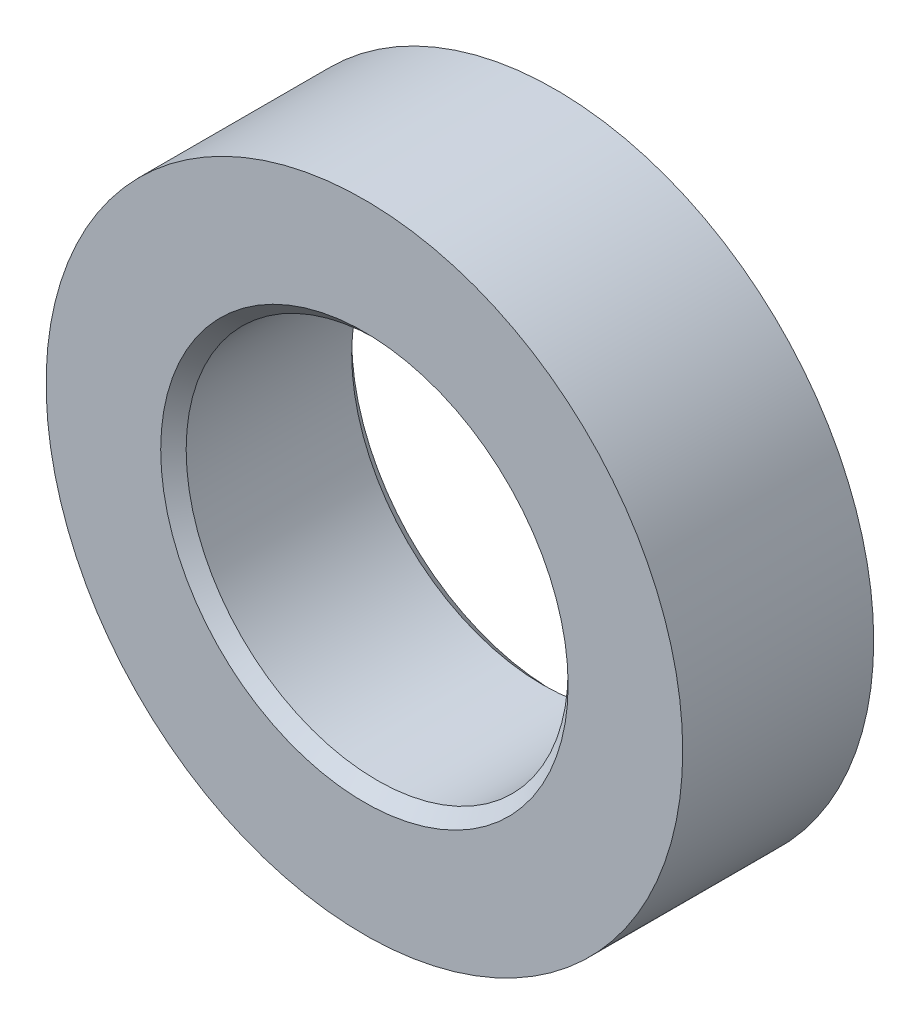
ISO-10303-21;
HEADER;
FILE_DESCRIPTION(('STEP AP214'),'2;1');
FILE_NAME('part.step','',(''),(''),'','','');
FILE_SCHEMA(('AUTOMOTIVE_DESIGN { 1 0 10303 214 1 1 1 1 }'));
ENDSEC;
DATA;
#1=APPLICATION_CONTEXT('core data for automotive mechanical design processes');
#2=APPLICATION_PROTOCOL_DEFINITION('international standard','automotive_design',2000,#1);
#3=PRODUCT_CONTEXT('',#1,'mechanical');
#4=PRODUCT('Part','Part','',(#3));
#5=PRODUCT_RELATED_PRODUCT_CATEGORY('part','',(#4));
#6=PRODUCT_DEFINITION_FORMATION('','',#4);
#7=PRODUCT_DEFINITION_CONTEXT('part definition',#1,'design');
#8=PRODUCT_DEFINITION('design','',#6,#7);
#9=PRODUCT_DEFINITION_SHAPE('','',#8);
#10=(LENGTH_UNIT() NAMED_UNIT(*) SI_UNIT(.MILLI.,.METRE.));
#11=(NAMED_UNIT(*) PLANE_ANGLE_UNIT() SI_UNIT($,.RADIAN.));
#12=(NAMED_UNIT(*) SI_UNIT($,.STERADIAN.) SOLID_ANGLE_UNIT());
#13=UNCERTAINTY_MEASURE_WITH_UNIT(LENGTH_MEASURE(1.E-05),#10,'distance_accuracy_value','');
#14=(GEOMETRIC_REPRESENTATION_CONTEXT(3) GLOBAL_UNCERTAINTY_ASSIGNED_CONTEXT((#13)) GLOBAL_UNIT_ASSIGNED_CONTEXT((#10,
#11,#12)) REPRESENTATION_CONTEXT('',''));
#15=CARTESIAN_POINT('',(0.,0.,0.));
#16=DIRECTION('',(0.,0.,1.));
#17=DIRECTION('',(1.,0.,0.));
#18=AXIS2_PLACEMENT_3D('',#15,#16,#17);
#19=CARTESIAN_POINT('',(0.,0.,15.));
#20=DIRECTION('',(0.,0.,1.));
#21=DIRECTION('',(1.,0.,0.));
#22=AXIS2_PLACEMENT_3D('',#19,#20,#21);
#23=PLANE('',#22);
#24=CARTESIAN_POINT('',(0.,0.,15.));
#25=DIRECTION('',(0.,0.,1.));
#26=DIRECTION('',(1.,0.,0.));
#27=AXIS2_PLACEMENT_3D('',#24,#25,#26);
#28=CIRCLE('',#27,16.);
#29=CARTESIAN_POINT('',(16.,0.,15.));
#30=VERTEX_POINT('',#29);
#31=EDGE_CURVE('E10',#30,#30,#28,.F.);
#32=ORIENTED_EDGE('',*,*,#31,.T.);
#33=EDGE_LOOP('',(#32));
#34=FACE_BOUND('',#33,.T.);
#35=CARTESIAN_POINT('',(0.,0.,15.));
#36=DIRECTION('',(0.,0.,1.));
#37=DIRECTION('',(1.,0.,0.));
#38=AXIS2_PLACEMENT_3D('',#35,#36,#37);
#39=CIRCLE('',#38,25.);
#40=CARTESIAN_POINT('',(25.,0.,15.));
#41=VERTEX_POINT('',#40);
#42=EDGE_CURVE('E50',#41,#41,#39,.T.);
#43=ORIENTED_EDGE('',*,*,#42,.T.);
#44=EDGE_LOOP('',(#43));
#45=FACE_BOUND('',#44,.T.);
#46=ADVANCED_FACE('F30',(#34,#45),#23,.T.);
#47=CARTESIAN_POINT('',(0.,0.,0.));
#48=DIRECTION('',(0.,0.,1.));
#49=DIRECTION('',(1.,0.,0.));
#50=AXIS2_PLACEMENT_3D('',#47,#48,#49);
#51=PLANE('',#50);
#52=CARTESIAN_POINT('',(0.,0.,0.));
#53=DIRECTION('',(0.,0.,1.));
#54=DIRECTION('',(1.,0.,0.));
#55=AXIS2_PLACEMENT_3D('',#52,#53,#54);
#56=CIRCLE('',#55,16.);
#57=CARTESIAN_POINT('',(16.,0.,0.));
#58=VERTEX_POINT('',#57);
#59=EDGE_CURVE('E45',#58,#58,#56,.T.);
#60=ORIENTED_EDGE('',*,*,#59,.T.);
#61=EDGE_LOOP('',(#60));
#62=FACE_BOUND('',#61,.T.);
#63=CARTESIAN_POINT('',(0.,0.,0.));
#64=DIRECTION('',(0.,0.,1.));
#65=DIRECTION('',(1.,0.,0.));
#66=AXIS2_PLACEMENT_3D('',#63,#64,#65);
#67=CIRCLE('',#66,25.);
#68=CARTESIAN_POINT('',(25.,0.,0.));
#69=VERTEX_POINT('',#68);
#70=EDGE_CURVE('E51',#69,#69,#67,.T.);
#71=ORIENTED_EDGE('',*,*,#70,.F.);
#72=EDGE_LOOP('',(#71));
#73=FACE_BOUND('',#72,.T.);
#74=ADVANCED_FACE('F62',(#62,#73),#51,.F.);
#75=CARTESIAN_POINT('',(0.,0.,15.));
#76=DIRECTION('',(0.,0.,-1.));
#77=DIRECTION('',(-1.,0.,0.));
#78=AXIS2_PLACEMENT_3D('',#75,#76,#77);
#79=CYLINDRICAL_SURFACE('',#78,25.);
#80=ORIENTED_EDGE('',*,*,#42,.F.);
#81=EDGE_LOOP('',(#80));
#82=FACE_BOUND('',#81,.T.);
#83=ORIENTED_EDGE('',*,*,#70,.T.);
#84=EDGE_LOOP('',(#83));
#85=FACE_BOUND('',#84,.T.);
#86=ADVANCED_FACE('F58',(#82,#85),#79,.T.);
#87=CARTESIAN_POINT('',(0.,0.,15.));
#88=DIRECTION('',(0.,0.,-1.));
#89=DIRECTION('',(-1.,0.,0.));
#90=AXIS2_PLACEMENT_3D('',#87,#88,#89);
#91=CYLINDRICAL_SURFACE('',#90,15.);
#92=CARTESIAN_POINT('',(0.,0.,1.00000000000003));
#93=DIRECTION('',(0.,0.,1.));
#94=DIRECTION('',(1.,0.,0.));
#95=AXIS2_PLACEMENT_3D('',#92,#93,#94);
#96=CIRCLE('',#95,15.);
#97=CARTESIAN_POINT('',(15.,0.,1.00000000000003));
#98=VERTEX_POINT('',#97);
#99=EDGE_CURVE('E37',#98,#98,#96,.F.);
#100=ORIENTED_EDGE('',*,*,#99,.T.);
#101=EDGE_LOOP('',(#100));
#102=FACE_BOUND('',#101,.T.);
#103=CARTESIAN_POINT('',(0.,0.,14.));
#104=DIRECTION('',(0.,0.,1.));
#105=DIRECTION('',(1.,0.,0.));
#106=AXIS2_PLACEMENT_3D('',#103,#104,#105);
#107=CIRCLE('',#106,15.);
#108=CARTESIAN_POINT('',(15.,0.,14.));
#109=VERTEX_POINT('',#108);
#110=EDGE_CURVE('E41',#109,#109,#107,.T.);
#111=ORIENTED_EDGE('',*,*,#110,.T.);
#112=EDGE_LOOP('',(#111));
#113=FACE_BOUND('',#112,.T.);
#114=ADVANCED_FACE('F61',(#102,#113),#91,.F.);
#115=CARTESIAN_POINT('',(0.,0.,0.));
#116=DIRECTION('',(0.,0.,-1.));
#117=DIRECTION('',(-1.,0.,0.));
#118=AXIS2_PLACEMENT_3D('',#115,#116,#117);
#119=CONICAL_SURFACE('',#118,16.,0.785398163397443);
#120=ORIENTED_EDGE('',*,*,#99,.F.);
#121=EDGE_LOOP('',(#120));
#122=FACE_BOUND('',#121,.T.);
#123=ORIENTED_EDGE('',*,*,#59,.F.);
#124=EDGE_LOOP('',(#123));
#125=FACE_BOUND('',#124,.T.);
#126=ADVANCED_FACE('F74',(#122,#125),#119,.F.);
#127=CARTESIAN_POINT('',(0.,0.,14.));
#128=DIRECTION('',(0.,0.,1.));
#129=DIRECTION('',(1.,0.,0.));
#130=AXIS2_PLACEMENT_3D('',#127,#128,#129);
#131=CONICAL_SURFACE('',#130,15.,0.785398163397453);
#132=ORIENTED_EDGE('',*,*,#31,.F.);
#133=EDGE_LOOP('',(#132));
#134=FACE_BOUND('',#133,.T.);
#135=ORIENTED_EDGE('',*,*,#110,.F.);
#136=EDGE_LOOP('',(#135));
#137=FACE_BOUND('',#136,.T.);
#138=ADVANCED_FACE('F32',(#134,#137),#131,.F.);
#139=CLOSED_SHELL('',(#46,#74,#86,#114,#126,#138));
#140=MANIFOLD_SOLID_BREP('B2',#139);
#141=ADVANCED_BREP_SHAPE_REPRESENTATION('',(#18,#140),#14);
#142=SHAPE_DEFINITION_REPRESENTATION(#9,#141);
ENDSEC;
END-ISO-10303-21;
